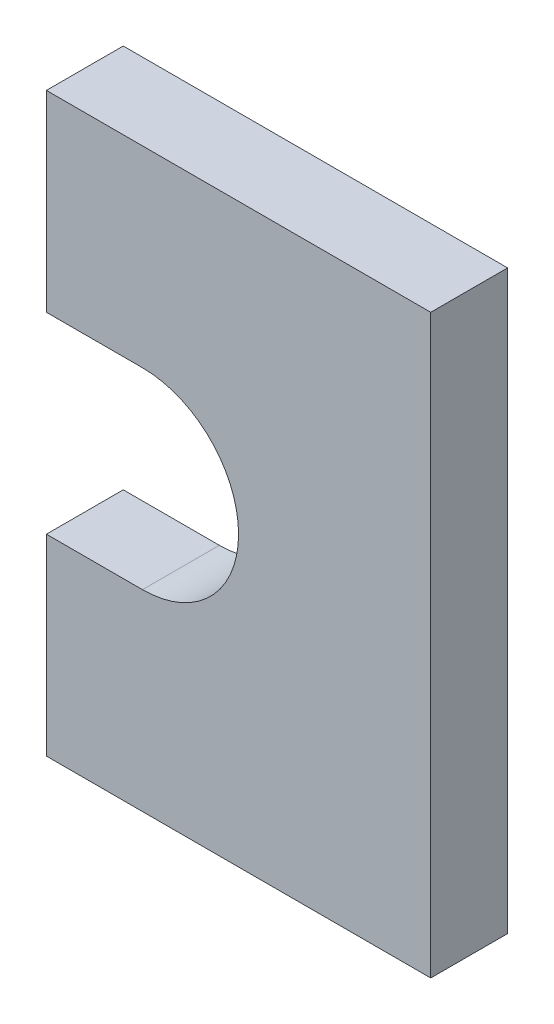
ISO-10303-21;
HEADER;
FILE_DESCRIPTION(('STEP AP214'),'2;1');
FILE_NAME('part.step','',(''),(''),'','','');
FILE_SCHEMA(('AUTOMOTIVE_DESIGN { 1 0 10303 214 1 1 1 1 }'));
ENDSEC;
DATA;
#1=APPLICATION_CONTEXT('core data for automotive mechanical design processes');
#2=APPLICATION_PROTOCOL_DEFINITION('international standard','automotive_design',2000,#1);
#3=PRODUCT_CONTEXT('',#1,'mechanical');
#4=PRODUCT('Part','Part','',(#3));
#5=PRODUCT_RELATED_PRODUCT_CATEGORY('part','',(#4));
#6=PRODUCT_DEFINITION_FORMATION('','',#4);
#7=PRODUCT_DEFINITION_CONTEXT('part definition',#1,'design');
#8=PRODUCT_DEFINITION('design','',#6,#7);
#9=PRODUCT_DEFINITION_SHAPE('','',#8);
#10=(LENGTH_UNIT() NAMED_UNIT(*) SI_UNIT(.MILLI.,.METRE.));
#11=(NAMED_UNIT(*) PLANE_ANGLE_UNIT() SI_UNIT($,.RADIAN.));
#12=(NAMED_UNIT(*) SI_UNIT($,.STERADIAN.) SOLID_ANGLE_UNIT());
#13=UNCERTAINTY_MEASURE_WITH_UNIT(LENGTH_MEASURE(1.E-05),#10,'distance_accuracy_value','');
#14=(GEOMETRIC_REPRESENTATION_CONTEXT(3) GLOBAL_UNCERTAINTY_ASSIGNED_CONTEXT((#13)) GLOBAL_UNIT_ASSIGNED_CONTEXT((#10,
#11,#12)) REPRESENTATION_CONTEXT('',''));
#15=CARTESIAN_POINT('',(0.,0.,0.));
#16=DIRECTION('',(0.,0.,1.));
#17=DIRECTION('',(1.,0.,0.));
#18=AXIS2_PLACEMENT_3D('',#15,#16,#17);
#19=CARTESIAN_POINT('',(5.,-7.5,2.));
#20=DIRECTION('',(-1.,0.,0.));
#21=DIRECTION('',(0.,0.,1.));
#22=AXIS2_PLACEMENT_3D('',#19,#20,#21);
#23=PLANE('',#22);
#24=DIRECTION('',(0.,1.,0.));
#25=VECTOR('',#24,1.);
#26=CARTESIAN_POINT('',(5.,-7.5,0.));
#27=LINE('',#26,#25);
#28=CARTESIAN_POINT('',(5.,-7.5,0.));
#29=VERTEX_POINT('',#28);
#30=CARTESIAN_POINT('',(5.,7.5,0.));
#31=VERTEX_POINT('',#30);
#32=EDGE_CURVE('E129',#29,#31,#27,.T.);
#33=ORIENTED_EDGE('',*,*,#32,.T.);
#34=DIRECTION('',(0.,0.,-1.));
#35=VECTOR('',#34,1.);
#36=CARTESIAN_POINT('',(5.,7.5,2.));
#37=LINE('',#36,#35);
#38=CARTESIAN_POINT('',(5.,7.5,2.));
#39=VERTEX_POINT('',#38);
#40=EDGE_CURVE('E11',#39,#31,#37,.T.);
#41=ORIENTED_EDGE('',*,*,#40,.F.);
#42=DIRECTION('',(0.,1.,0.));
#43=VECTOR('',#42,1.);
#44=CARTESIAN_POINT('',(5.,-7.5,2.));
#45=LINE('',#44,#43);
#46=CARTESIAN_POINT('',(5.,-7.5,2.));
#47=VERTEX_POINT('',#46);
#48=EDGE_CURVE('E143',#47,#39,#45,.T.);
#49=ORIENTED_EDGE('',*,*,#48,.F.);
#50=DIRECTION('',(0.,0.,-1.));
#51=VECTOR('',#50,1.);
#52=CARTESIAN_POINT('',(5.,-7.5,2.));
#53=LINE('',#52,#51);
#54=EDGE_CURVE('E125',#47,#29,#53,.T.);
#55=ORIENTED_EDGE('',*,*,#54,.T.);
#56=EDGE_LOOP('',(#33,#41,#49,#55));
#57=FACE_BOUND('',#56,.T.);
#58=ADVANCED_FACE('F33',(#57),#23,.F.);
#59=CARTESIAN_POINT('',(-5.,7.5,2.));
#60=DIRECTION('',(0.,-1.,0.));
#61=DIRECTION('',(0.,0.,-1.));
#62=AXIS2_PLACEMENT_3D('',#59,#60,#61);
#63=PLANE('',#62);
#64=DIRECTION('',(-1.,0.,0.));
#65=VECTOR('',#64,1.);
#66=CARTESIAN_POINT('',(-5.,7.5,0.));
#67=LINE('',#66,#65);
#68=CARTESIAN_POINT('',(-5.,7.5,0.));
#69=VERTEX_POINT('',#68);
#70=EDGE_CURVE('E132',#31,#69,#67,.T.);
#71=ORIENTED_EDGE('',*,*,#70,.T.);
#72=DIRECTION('',(0.,0.,-1.));
#73=VECTOR('',#72,1.);
#74=CARTESIAN_POINT('',(-5.,7.5,2.));
#75=LINE('',#74,#73);
#76=CARTESIAN_POINT('',(-5.,7.5,2.));
#77=VERTEX_POINT('',#76);
#78=EDGE_CURVE('E41',#77,#69,#75,.T.);
#79=ORIENTED_EDGE('',*,*,#78,.F.);
#80=DIRECTION('',(-1.,0.,0.));
#81=VECTOR('',#80,1.);
#82=CARTESIAN_POINT('',(-5.,7.5,2.));
#83=LINE('',#82,#81);
#84=EDGE_CURVE('E92',#39,#77,#83,.T.);
#85=ORIENTED_EDGE('',*,*,#84,.F.);
#86=ORIENTED_EDGE('',*,*,#40,.T.);
#87=EDGE_LOOP('',(#71,#79,#85,#86));
#88=FACE_BOUND('',#87,.T.);
#89=ADVANCED_FACE('F178',(#88),#63,.F.);
#90=CARTESIAN_POINT('',(-5.,2.5,2.));
#91=DIRECTION('',(1.,0.,0.));
#92=DIRECTION('',(0.,0.,-1.));
#93=AXIS2_PLACEMENT_3D('',#90,#91,#92);
#94=PLANE('',#93);
#95=DIRECTION('',(0.,-1.,0.));
#96=VECTOR('',#95,1.);
#97=CARTESIAN_POINT('',(-5.,2.5,0.));
#98=LINE('',#97,#96);
#99=CARTESIAN_POINT('',(-5.,2.5,0.));
#100=VERTEX_POINT('',#99);
#101=EDGE_CURVE('E134',#69,#100,#98,.T.);
#102=ORIENTED_EDGE('',*,*,#101,.T.);
#103=DIRECTION('',(0.,0.,-1.));
#104=VECTOR('',#103,1.);
#105=CARTESIAN_POINT('',(-5.,2.5,2.));
#106=LINE('',#105,#104);
#107=CARTESIAN_POINT('',(-5.,2.5,2.));
#108=VERTEX_POINT('',#107);
#109=EDGE_CURVE('E150',#108,#100,#106,.T.);
#110=ORIENTED_EDGE('',*,*,#109,.F.);
#111=DIRECTION('',(0.,-1.,0.));
#112=VECTOR('',#111,1.);
#113=CARTESIAN_POINT('',(-5.,2.5,2.));
#114=LINE('',#113,#112);
#115=EDGE_CURVE('E158',#77,#108,#114,.T.);
#116=ORIENTED_EDGE('',*,*,#115,.F.);
#117=ORIENTED_EDGE('',*,*,#78,.T.);
#118=EDGE_LOOP('',(#102,#110,#116,#117));
#119=FACE_BOUND('',#118,.T.);
#120=ADVANCED_FACE('F156',(#119),#94,.F.);
#121=CARTESIAN_POINT('',(-5.,2.5,2.));
#122=DIRECTION('',(0.,1.,0.));
#123=DIRECTION('',(0.,0.,1.));
#124=AXIS2_PLACEMENT_3D('',#121,#122,#123);
#125=PLANE('',#124);
#126=DIRECTION('',(1.,0.,0.));
#127=VECTOR('',#126,1.);
#128=CARTESIAN_POINT('',(-5.,2.5,0.));
#129=LINE('',#128,#127);
#130=CARTESIAN_POINT('',(-2.5,2.5,0.));
#131=VERTEX_POINT('',#130);
#132=EDGE_CURVE('E136',#100,#131,#129,.T.);
#133=ORIENTED_EDGE('',*,*,#132,.T.);
#134=DIRECTION('',(0.,0.,-1.));
#135=VECTOR('',#134,1.);
#136=CARTESIAN_POINT('',(-2.5,2.5,2.));
#137=LINE('',#136,#135);
#138=CARTESIAN_POINT('',(-2.5,2.5,2.));
#139=VERTEX_POINT('',#138);
#140=EDGE_CURVE('E147',#139,#131,#137,.T.);
#141=ORIENTED_EDGE('',*,*,#140,.F.);
#142=DIRECTION('',(1.,0.,0.));
#143=VECTOR('',#142,1.);
#144=CARTESIAN_POINT('',(-5.,2.5,2.));
#145=LINE('',#144,#143);
#146=EDGE_CURVE('E170',#108,#139,#145,.T.);
#147=ORIENTED_EDGE('',*,*,#146,.F.);
#148=ORIENTED_EDGE('',*,*,#109,.T.);
#149=EDGE_LOOP('',(#133,#141,#147,#148));
#150=FACE_BOUND('',#149,.T.);
#151=ADVANCED_FACE('F166',(#150),#125,.F.);
#152=CARTESIAN_POINT('',(-2.5,0.,2.));
#153=DIRECTION('',(0.,0.,-1.));
#154=DIRECTION('',(-1.,0.,0.));
#155=AXIS2_PLACEMENT_3D('',#152,#153,#154);
#156=CYLINDRICAL_SURFACE('',#155,2.5);
#157=CARTESIAN_POINT('',(-2.5,0.,0.));
#158=DIRECTION('',(0.,0.,-1.));
#159=DIRECTION('',(-1.,0.,0.));
#160=AXIS2_PLACEMENT_3D('',#157,#158,#159);
#161=CIRCLE('',#160,2.5);
#162=CARTESIAN_POINT('',(-2.5,-2.5,0.));
#163=VERTEX_POINT('',#162);
#164=EDGE_CURVE('E138',#131,#163,#161,.T.);
#165=ORIENTED_EDGE('',*,*,#164,.T.);
#166=DIRECTION('',(0.,0.,-1.));
#167=VECTOR('',#166,1.);
#168=CARTESIAN_POINT('',(-2.5,-2.5,2.));
#169=LINE('',#168,#167);
#170=CARTESIAN_POINT('',(-2.5,-2.5,2.));
#171=VERTEX_POINT('',#170);
#172=EDGE_CURVE('E120',#171,#163,#169,.T.);
#173=ORIENTED_EDGE('',*,*,#172,.F.);
#174=CARTESIAN_POINT('',(-2.5,0.,2.));
#175=DIRECTION('',(0.,0.,-1.));
#176=DIRECTION('',(-1.,0.,0.));
#177=AXIS2_PLACEMENT_3D('',#174,#175,#176);
#178=CIRCLE('',#177,2.5);
#179=EDGE_CURVE('E111',#139,#171,#178,.T.);
#180=ORIENTED_EDGE('',*,*,#179,.F.);
#181=ORIENTED_EDGE('',*,*,#140,.T.);
#182=EDGE_LOOP('',(#165,#173,#180,#181));
#183=FACE_BOUND('',#182,.T.);
#184=ADVANCED_FACE('F169',(#183),#156,.F.);
#185=CARTESIAN_POINT('',(-5.,-2.5,2.));
#186=DIRECTION('',(0.,-1.,0.));
#187=DIRECTION('',(1.,0.,0.));
#188=AXIS2_PLACEMENT_3D('',#185,#186,#187);
#189=PLANE('',#188);
#190=DIRECTION('',(-1.,0.,0.));
#191=VECTOR('',#190,1.);
#192=CARTESIAN_POINT('',(-5.,-2.5,0.));
#193=LINE('',#192,#191);
#194=CARTESIAN_POINT('',(-5.,-2.5,0.));
#195=VERTEX_POINT('',#194);
#196=EDGE_CURVE('E119',#163,#195,#193,.T.);
#197=ORIENTED_EDGE('',*,*,#196,.T.);
#198=DIRECTION('',(0.,0.,-1.));
#199=VECTOR('',#198,1.);
#200=CARTESIAN_POINT('',(-5.,-2.5,2.));
#201=LINE('',#200,#199);
#202=CARTESIAN_POINT('',(-5.,-2.5,2.));
#203=VERTEX_POINT('',#202);
#204=EDGE_CURVE('E116',#203,#195,#201,.T.);
#205=ORIENTED_EDGE('',*,*,#204,.F.);
#206=DIRECTION('',(-1.,0.,0.));
#207=VECTOR('',#206,1.);
#208=CARTESIAN_POINT('',(-5.,-2.5,2.));
#209=LINE('',#208,#207);
#210=EDGE_CURVE('E105',#171,#203,#209,.T.);
#211=ORIENTED_EDGE('',*,*,#210,.F.);
#212=ORIENTED_EDGE('',*,*,#172,.T.);
#213=EDGE_LOOP('',(#197,#205,#211,#212));
#214=FACE_BOUND('',#213,.T.);
#215=ADVANCED_FACE('F117',(#214),#189,.F.);
#216=CARTESIAN_POINT('',(-5.,-7.5,2.));
#217=DIRECTION('',(1.,0.,0.));
#218=DIRECTION('',(0.,0.,-1.));
#219=AXIS2_PLACEMENT_3D('',#216,#217,#218);
#220=PLANE('',#219);
#221=DIRECTION('',(0.,-1.,0.));
#222=VECTOR('',#221,1.);
#223=CARTESIAN_POINT('',(-5.,-7.5,0.));
#224=LINE('',#223,#222);
#225=CARTESIAN_POINT('',(-5.,-7.5,0.));
#226=VERTEX_POINT('',#225);
#227=EDGE_CURVE('E78',#195,#226,#224,.T.);
#228=ORIENTED_EDGE('',*,*,#227,.T.);
#229=DIRECTION('',(0.,0.,-1.));
#230=VECTOR('',#229,1.);
#231=CARTESIAN_POINT('',(-5.,-7.5,2.));
#232=LINE('',#231,#230);
#233=CARTESIAN_POINT('',(-5.,-7.5,2.));
#234=VERTEX_POINT('',#233);
#235=EDGE_CURVE('E121',#234,#226,#232,.T.);
#236=ORIENTED_EDGE('',*,*,#235,.F.);
#237=DIRECTION('',(0.,-1.,0.));
#238=VECTOR('',#237,1.);
#239=CARTESIAN_POINT('',(-5.,-7.5,2.));
#240=LINE('',#239,#238);
#241=EDGE_CURVE('E109',#203,#234,#240,.T.);
#242=ORIENTED_EDGE('',*,*,#241,.F.);
#243=ORIENTED_EDGE('',*,*,#204,.T.);
#244=EDGE_LOOP('',(#228,#236,#242,#243));
#245=FACE_BOUND('',#244,.T.);
#246=ADVANCED_FACE('F123',(#245),#220,.F.);
#247=CARTESIAN_POINT('',(-5.,-7.5,2.));
#248=DIRECTION('',(0.,1.,0.));
#249=DIRECTION('',(0.,0.,1.));
#250=AXIS2_PLACEMENT_3D('',#247,#248,#249);
#251=PLANE('',#250);
#252=DIRECTION('',(1.,0.,0.));
#253=VECTOR('',#252,1.);
#254=CARTESIAN_POINT('',(-5.,-7.5,0.));
#255=LINE('',#254,#253);
#256=EDGE_CURVE('E84',#226,#29,#255,.T.);
#257=ORIENTED_EDGE('',*,*,#256,.T.);
#258=ORIENTED_EDGE('',*,*,#54,.F.);
#259=DIRECTION('',(1.,0.,0.));
#260=VECTOR('',#259,1.);
#261=CARTESIAN_POINT('',(-5.,-7.5,2.));
#262=LINE('',#261,#260);
#263=EDGE_CURVE('E49',#234,#47,#262,.T.);
#264=ORIENTED_EDGE('',*,*,#263,.F.);
#265=ORIENTED_EDGE('',*,*,#235,.T.);
#266=EDGE_LOOP('',(#257,#258,#264,#265));
#267=FACE_BOUND('',#266,.T.);
#268=ADVANCED_FACE('F194',(#267),#251,.F.);
#269=CARTESIAN_POINT('',(-2.5,0.,2.));
#270=DIRECTION('',(0.,0.,-1.));
#271=DIRECTION('',(-1.,0.,0.));
#272=AXIS2_PLACEMENT_3D('',#269,#270,#271);
#273=PLANE('',#272);
#274=ORIENTED_EDGE('',*,*,#48,.T.);
#275=ORIENTED_EDGE('',*,*,#84,.T.);
#276=ORIENTED_EDGE('',*,*,#115,.T.);
#277=ORIENTED_EDGE('',*,*,#146,.T.);
#278=ORIENTED_EDGE('',*,*,#179,.T.);
#279=ORIENTED_EDGE('',*,*,#210,.T.);
#280=ORIENTED_EDGE('',*,*,#241,.T.);
#281=ORIENTED_EDGE('',*,*,#263,.T.);
#282=EDGE_LOOP('',(#274,#275,#276,#277,#278,#279,#280,#281));
#283=FACE_BOUND('',#282,.T.);
#284=ADVANCED_FACE('F107',(#283),#273,.F.);
#285=CARTESIAN_POINT('',(-2.5,0.,0.));
#286=DIRECTION('',(0.,0.,-1.));
#287=DIRECTION('',(-1.,0.,0.));
#288=AXIS2_PLACEMENT_3D('',#285,#286,#287);
#289=PLANE('',#288);
#290=ORIENTED_EDGE('',*,*,#32,.F.);
#291=ORIENTED_EDGE('',*,*,#256,.F.);
#292=ORIENTED_EDGE('',*,*,#227,.F.);
#293=ORIENTED_EDGE('',*,*,#196,.F.);
#294=ORIENTED_EDGE('',*,*,#164,.F.);
#295=ORIENTED_EDGE('',*,*,#132,.F.);
#296=ORIENTED_EDGE('',*,*,#101,.F.);
#297=ORIENTED_EDGE('',*,*,#70,.F.);
#298=EDGE_LOOP('',(#290,#291,#292,#293,#294,#295,#296,#297));
#299=FACE_BOUND('',#298,.T.);
#300=ADVANCED_FACE('F162',(#299),#289,.T.);
#301=CLOSED_SHELL('',(#58,#89,#120,#151,#184,#215,#246,#268,#284,#300));
#302=MANIFOLD_SOLID_BREP('B2',#301);
#303=ADVANCED_BREP_SHAPE_REPRESENTATION('',(#18,#302),#14);
#304=SHAPE_DEFINITION_REPRESENTATION(#9,#303);
ENDSEC;
END-ISO-10303-21;
